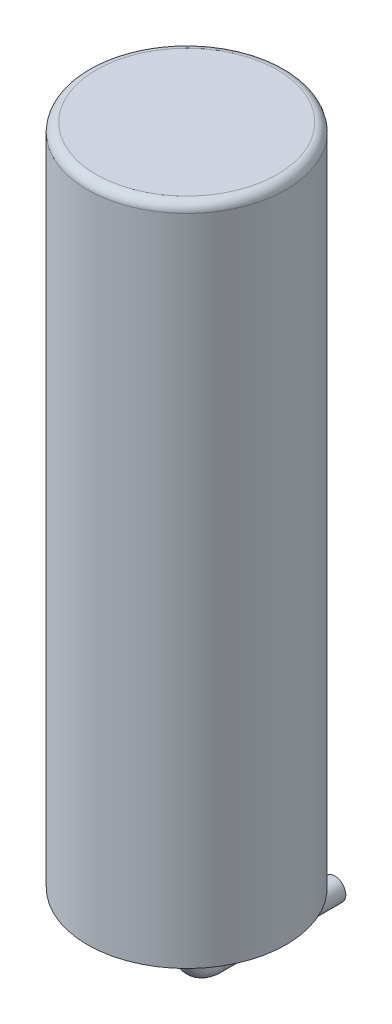
ISO-10303-21;
HEADER;
FILE_DESCRIPTION(('STEP AP214'),'2;1');
FILE_NAME('part.step','',(''),(''),'','','');
FILE_SCHEMA(('AUTOMOTIVE_DESIGN { 1 0 10303 214 1 1 1 1 }'));
ENDSEC;
DATA;
#1=APPLICATION_CONTEXT('core data for automotive mechanical design processes');
#2=APPLICATION_PROTOCOL_DEFINITION('international standard','automotive_design',2000,#1);
#3=PRODUCT_CONTEXT('',#1,'mechanical');
#4=PRODUCT('Part','Part','',(#3));
#5=PRODUCT_RELATED_PRODUCT_CATEGORY('part','',(#4));
#6=PRODUCT_DEFINITION_FORMATION('','',#4);
#7=PRODUCT_DEFINITION_CONTEXT('part definition',#1,'design');
#8=PRODUCT_DEFINITION('design','',#6,#7);
#9=PRODUCT_DEFINITION_SHAPE('','',#8);
#10=(LENGTH_UNIT() NAMED_UNIT(*) SI_UNIT(.MILLI.,.METRE.));
#11=(NAMED_UNIT(*) PLANE_ANGLE_UNIT() SI_UNIT($,.RADIAN.));
#12=(NAMED_UNIT(*) SI_UNIT($,.STERADIAN.) SOLID_ANGLE_UNIT());
#13=UNCERTAINTY_MEASURE_WITH_UNIT(LENGTH_MEASURE(1.E-05),#10,'distance_accuracy_value','');
#14=(GEOMETRIC_REPRESENTATION_CONTEXT(3) GLOBAL_UNCERTAINTY_ASSIGNED_CONTEXT((#13)) GLOBAL_UNIT_ASSIGNED_CONTEXT((#10,
#11,#12)) REPRESENTATION_CONTEXT('',''));
#15=CARTESIAN_POINT('',(0.,0.,0.));
#16=DIRECTION('',(0.,0.,1.));
#17=DIRECTION('',(1.,0.,0.));
#18=AXIS2_PLACEMENT_3D('',#15,#16,#17);
#19=CARTESIAN_POINT('',(0.,15.,0.));
#20=DIRECTION('',(0.,-1.,0.));
#21=DIRECTION('',(0.,0.,-1.));
#22=AXIS2_PLACEMENT_3D('',#19,#20,#21);
#23=CYLINDRICAL_SURFACE('',#22,2.25);
#24=CARTESIAN_POINT('',(0.,14.8,0.));
#25=DIRECTION('',(0.,1.,0.));
#26=DIRECTION('',(0.,0.,1.));
#27=AXIS2_PLACEMENT_3D('',#24,#25,#26);
#28=CIRCLE('',#27,2.25);
#29=CARTESIAN_POINT('',(0.,14.8,2.25));
#30=VERTEX_POINT('',#29);
#31=EDGE_CURVE('E10',#30,#30,#28,.F.);
#32=ORIENTED_EDGE('',*,*,#31,.T.);
#33=EDGE_LOOP('',(#32));
#34=FACE_BOUND('',#33,.T.);
#35=CARTESIAN_POINT('',(0.,0.,0.));
#36=DIRECTION('',(0.,1.,0.));
#37=DIRECTION('',(0.,0.,1.));
#38=AXIS2_PLACEMENT_3D('',#35,#36,#37);
#39=CIRCLE('',#38,2.25);
#40=CARTESIAN_POINT('',(0.,0.,2.25));
#41=VERTEX_POINT('',#40);
#42=EDGE_CURVE('E52',#41,#41,#39,.T.);
#43=ORIENTED_EDGE('',*,*,#42,.T.);
#44=EDGE_LOOP('',(#43));
#45=FACE_BOUND('',#44,.T.);
#46=ADVANCED_FACE('F39',(#34,#45),#23,.T.);
#47=CARTESIAN_POINT('',(0.,15.,0.));
#48=DIRECTION('',(0.,1.,0.));
#49=DIRECTION('',(0.,0.,1.));
#50=AXIS2_PLACEMENT_3D('',#47,#48,#49);
#51=PLANE('',#50);
#52=CARTESIAN_POINT('',(0.,15.,0.));
#53=DIRECTION('',(0.,1.,0.));
#54=DIRECTION('',(0.,0.,1.));
#55=AXIS2_PLACEMENT_3D('',#52,#53,#54);
#56=CIRCLE('',#55,2.05);
#57=CARTESIAN_POINT('',(0.,15.,2.05));
#58=VERTEX_POINT('',#57);
#59=EDGE_CURVE('E47',#58,#58,#56,.T.);
#60=ORIENTED_EDGE('',*,*,#59,.T.);
#61=EDGE_LOOP('',(#60));
#62=FACE_BOUND('',#61,.T.);
#63=ADVANCED_FACE('F98',(#62),#51,.T.);
#64=CARTESIAN_POINT('',(0.,0.,0.));
#65=DIRECTION('',(0.,1.,0.));
#66=DIRECTION('',(0.,0.,1.));
#67=AXIS2_PLACEMENT_3D('',#64,#65,#66);
#68=PLANE('',#67);
#69=CARTESIAN_POINT('',(-1.125,0.,0.));
#70=DIRECTION('',(0.,-1.,0.));
#71=DIRECTION('',(0.,0.,-1.));
#72=AXIS2_PLACEMENT_3D('',#69,#70,#71);
#73=CIRCLE('',#72,0.1);
#74=CARTESIAN_POINT('',(-1.125,0.,-0.1));
#75=VERTEX_POINT('',#74);
#76=EDGE_CURVE('E87',#75,#75,#73,.T.);
#77=ORIENTED_EDGE('',*,*,#76,.F.);
#78=EDGE_LOOP('',(#77));
#79=FACE_BOUND('',#78,.T.);
#80=CARTESIAN_POINT('',(0.,0.,0.));
#81=DIRECTION('',(0.,-1.,0.));
#82=DIRECTION('',(0.,0.,-1.));
#83=AXIS2_PLACEMENT_3D('',#80,#81,#82);
#84=CIRCLE('',#83,0.25);
#85=CARTESIAN_POINT('',(0.,0.,-0.25));
#86=VERTEX_POINT('',#85);
#87=EDGE_CURVE('E71',#86,#86,#84,.T.);
#88=ORIENTED_EDGE('',*,*,#87,.F.);
#89=EDGE_LOOP('',(#88));
#90=FACE_BOUND('',#89,.T.);
#91=ORIENTED_EDGE('',*,*,#42,.F.);
#92=EDGE_LOOP('',(#91));
#93=FACE_BOUND('',#92,.T.);
#94=ADVANCED_FACE('F94',(#79,#90,#93),#68,.F.);
#95=CARTESIAN_POINT('',(0.,-1.7,-3.35));
#96=DIRECTION('',(0.,0.,-1.));
#97=DIRECTION('',(0.,1.,0.));
#98=AXIS2_PLACEMENT_3D('',#95,#96,#97);
#99=PLANE('',#98);
#100=CARTESIAN_POINT('',(0.,-1.7,-3.35));
#101=DIRECTION('',(0.,0.,-1.));
#102=DIRECTION('',(0.,1.,0.));
#103=AXIS2_PLACEMENT_3D('',#100,#101,#102);
#104=CIRCLE('',#103,0.25);
#105=CARTESIAN_POINT('',(0.,-1.45,-3.35));
#106=VERTEX_POINT('',#105);
#107=EDGE_CURVE('E57',#106,#106,#104,.T.);
#108=ORIENTED_EDGE('',*,*,#107,.T.);
#109=EDGE_LOOP('',(#108));
#110=FACE_BOUND('',#109,.T.);
#111=ADVANCED_FACE('F97',(#110),#99,.T.);
#112=CARTESIAN_POINT('',(0.,0.,0.));
#113=DIRECTION('',(0.,-1.,0.));
#114=DIRECTION('',(0.,0.,-1.));
#115=AXIS2_PLACEMENT_3D('',#112,#113,#114);
#116=CYLINDRICAL_SURFACE('',#115,0.25);
#117=CARTESIAN_POINT('',(0.,-1.1,0.));
#118=DIRECTION('',(0.,-1.,0.));
#119=DIRECTION('',(0.,0.,-1.));
#120=AXIS2_PLACEMENT_3D('',#117,#118,#119);
#121=CIRCLE('',#120,0.25);
#122=CARTESIAN_POINT('',(0.,-1.1,0.25));
#123=VERTEX_POINT('',#122);
#124=EDGE_CURVE('E67',#123,#123,#121,.T.);
#125=ORIENTED_EDGE('',*,*,#124,.F.);
#126=EDGE_LOOP('',(#125));
#127=FACE_BOUND('',#126,.T.);
#128=ORIENTED_EDGE('',*,*,#87,.T.);
#129=EDGE_LOOP('',(#128));
#130=FACE_BOUND('',#129,.T.);
#131=ADVANCED_FACE('F113',(#127,#130),#116,.T.);
#132=CARTESIAN_POINT('',(0.,-1.1,-0.6));
#133=DIRECTION('',(1.,0.,0.));
#134=DIRECTION('',(0.,0.,-1.));
#135=AXIS2_PLACEMENT_3D('',#132,#133,#134);
#136=TOROIDAL_SURFACE('',#135,0.6,0.25);
#137=CARTESIAN_POINT('',(0.,-1.7,-0.6));
#138=DIRECTION('',(0.,0.,-1.));
#139=DIRECTION('',(0.,1.,0.));
#140=AXIS2_PLACEMENT_3D('',#137,#138,#139);
#141=CIRCLE('',#140,0.25);
#142=CARTESIAN_POINT('',(0.,-1.95,-0.6));
#143=VERTEX_POINT('',#142);
#144=EDGE_CURVE('E63',#143,#143,#141,.T.);
#145=CARTESIAN_POINT('',(0.,-1.1,-0.6));
#146=DIRECTION('',(1.,0.,0.));
#147=DIRECTION('',(0.,0.,-1.));
#148=AXIS2_PLACEMENT_3D('',#145,#146,#147);
#149=CIRCLE('',#148,0.85);
#150=EDGE_CURVE('',#123,#143,#149,.T.);
#151=ORIENTED_EDGE('',*,*,#124,.T.);
#152=ORIENTED_EDGE('',*,*,#144,.F.);
#153=ORIENTED_EDGE('',*,*,#150,.T.);
#154=ORIENTED_EDGE('',*,*,#150,.F.);
#155=EDGE_LOOP('',(#151,#153,#152,#154));
#156=FACE_BOUND('',#155,.T.);
#157=ADVANCED_FACE('F119',(#156),#136,.T.);
#158=CARTESIAN_POINT('',(0.,-1.7,-0.6));
#159=DIRECTION('',(0.,0.,-1.));
#160=DIRECTION('',(-1.,0.,0.));
#161=AXIS2_PLACEMENT_3D('',#158,#159,#160);
#162=CYLINDRICAL_SURFACE('',#161,0.25);
#163=ORIENTED_EDGE('',*,*,#107,.F.);
#164=EDGE_LOOP('',(#163));
#165=FACE_BOUND('',#164,.T.);
#166=ORIENTED_EDGE('',*,*,#144,.T.);
#167=EDGE_LOOP('',(#166));
#168=FACE_BOUND('',#167,.T.);
#169=ADVANCED_FACE('F100',(#165,#168),#162,.T.);
#170=CARTESIAN_POINT('',(-1.125,-1.7,-1.1));
#171=DIRECTION('',(0.,0.,-1.));
#172=DIRECTION('',(0.,1.,0.));
#173=AXIS2_PLACEMENT_3D('',#170,#171,#172);
#174=PLANE('',#173);
#175=CARTESIAN_POINT('',(-1.125,-1.7,-1.1));
#176=DIRECTION('',(0.,0.,-1.));
#177=DIRECTION('',(0.,1.,0.));
#178=AXIS2_PLACEMENT_3D('',#175,#176,#177);
#179=CIRCLE('',#178,0.1);
#180=CARTESIAN_POINT('',(-1.125,-1.6,-1.1));
#181=VERTEX_POINT('',#180);
#182=EDGE_CURVE('E75',#181,#181,#179,.T.);
#183=ORIENTED_EDGE('',*,*,#182,.T.);
#184=EDGE_LOOP('',(#183));
#185=FACE_BOUND('',#184,.T.);
#186=ADVANCED_FACE('F118',(#185),#174,.T.);
#187=CARTESIAN_POINT('',(-1.125,0.,0.));
#188=DIRECTION('',(0.,-1.,0.));
#189=DIRECTION('',(0.,0.,-1.));
#190=AXIS2_PLACEMENT_3D('',#187,#188,#189);
#191=CYLINDRICAL_SURFACE('',#190,0.1);
#192=CARTESIAN_POINT('',(-1.125,-1.1,0.));
#193=DIRECTION('',(0.,-1.,0.));
#194=DIRECTION('',(0.,0.,-1.));
#195=AXIS2_PLACEMENT_3D('',#192,#193,#194);
#196=CIRCLE('',#195,0.1);
#197=CARTESIAN_POINT('',(-1.125,-1.1,0.1));
#198=VERTEX_POINT('',#197);
#199=EDGE_CURVE('E83',#198,#198,#196,.T.);
#200=ORIENTED_EDGE('',*,*,#199,.F.);
#201=EDGE_LOOP('',(#200));
#202=FACE_BOUND('',#201,.T.);
#203=ORIENTED_EDGE('',*,*,#76,.T.);
#204=EDGE_LOOP('',(#203));
#205=FACE_BOUND('',#204,.T.);
#206=ADVANCED_FACE('F92',(#202,#205),#191,.T.);
#207=CARTESIAN_POINT('',(-1.125,-1.1,-0.6));
#208=DIRECTION('',(1.,0.,0.));
#209=DIRECTION('',(0.,0.,-1.));
#210=AXIS2_PLACEMENT_3D('',#207,#208,#209);
#211=TOROIDAL_SURFACE('',#210,0.6,0.1);
#212=CARTESIAN_POINT('',(-1.125,-1.7,-0.6));
#213=DIRECTION('',(0.,0.,-1.));
#214=DIRECTION('',(0.,1.,0.));
#215=AXIS2_PLACEMENT_3D('',#212,#213,#214);
#216=CIRCLE('',#215,0.1);
#217=CARTESIAN_POINT('',(-1.125,-1.8,-0.6));
#218=VERTEX_POINT('',#217);
#219=EDGE_CURVE('E79',#218,#218,#216,.T.);
#220=CARTESIAN_POINT('',(-1.125,-1.1,-0.6));
#221=DIRECTION('',(1.,0.,0.));
#222=DIRECTION('',(0.,0.,-1.));
#223=AXIS2_PLACEMENT_3D('',#220,#221,#222);
#224=CIRCLE('',#223,0.7);
#225=EDGE_CURVE('',#198,#218,#224,.T.);
#226=ORIENTED_EDGE('',*,*,#199,.T.);
#227=ORIENTED_EDGE('',*,*,#219,.F.);
#228=ORIENTED_EDGE('',*,*,#225,.T.);
#229=ORIENTED_EDGE('',*,*,#225,.F.);
#230=EDGE_LOOP('',(#226,#228,#227,#229));
#231=FACE_BOUND('',#230,.T.);
#232=ADVANCED_FACE('F132',(#231),#211,.T.);
#233=CARTESIAN_POINT('',(-1.125,-1.7,-0.6));
#234=DIRECTION('',(0.,0.,-1.));
#235=DIRECTION('',(0.,1.,0.));
#236=AXIS2_PLACEMENT_3D('',#233,#234,#235);
#237=CYLINDRICAL_SURFACE('',#236,0.1);
#238=ORIENTED_EDGE('',*,*,#182,.F.);
#239=EDGE_LOOP('',(#238));
#240=FACE_BOUND('',#239,.T.);
#241=ORIENTED_EDGE('',*,*,#219,.T.);
#242=EDGE_LOOP('',(#241));
#243=FACE_BOUND('',#242,.T.);
#244=ADVANCED_FACE('F115',(#240,#243),#237,.T.);
#245=CARTESIAN_POINT('',(0.,14.8,0.));
#246=DIRECTION('',(0.,1.,0.));
#247=DIRECTION('',(0.,0.,1.));
#248=AXIS2_PLACEMENT_3D('',#245,#246,#247);
#249=TOROIDAL_SURFACE('',#248,2.05,0.2);
#250=ORIENTED_EDGE('',*,*,#31,.F.);
#251=EDGE_LOOP('',(#250));
#252=FACE_BOUND('',#251,.T.);
#253=ORIENTED_EDGE('',*,*,#59,.F.);
#254=EDGE_LOOP('',(#253));
#255=FACE_BOUND('',#254,.T.);
#256=ADVANCED_FACE('F41',(#252,#255),#249,.T.);
#257=CLOSED_SHELL('',(#46,#63,#94,#111,#131,#157,#169,#186,#206,#232,#244,#256));
#258=MANIFOLD_SOLID_BREP('B2',#257);
#259=ADVANCED_BREP_SHAPE_REPRESENTATION('',(#18,#258),#14);
#260=SHAPE_DEFINITION_REPRESENTATION(#9,#259);
ENDSEC;
END-ISO-10303-21;
